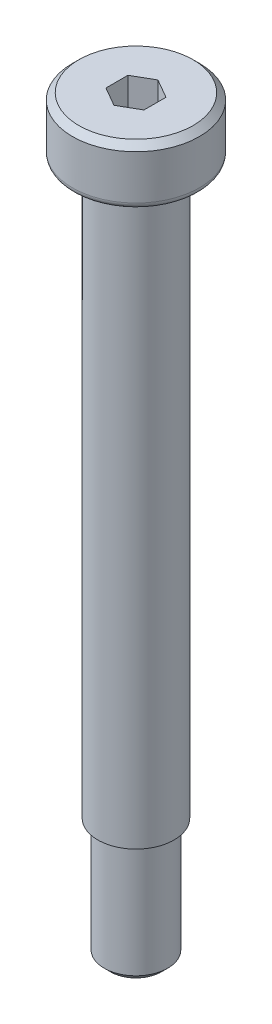
ISO-10303-21;
HEADER;
FILE_DESCRIPTION(('STEP AP214'),'2;1');
FILE_NAME('part.step','',(''),(''),'','','');
FILE_SCHEMA(('AUTOMOTIVE_DESIGN { 1 0 10303 214 1 1 1 1 }'));
ENDSEC;
DATA;
#1=APPLICATION_CONTEXT('core data for automotive mechanical design processes');
#2=APPLICATION_PROTOCOL_DEFINITION('international standard','automotive_design',2000,#1);
#3=PRODUCT_CONTEXT('',#1,'mechanical');
#4=PRODUCT('Part','Part','',(#3));
#5=PRODUCT_RELATED_PRODUCT_CATEGORY('part','',(#4));
#6=PRODUCT_DEFINITION_FORMATION('','',#4);
#7=PRODUCT_DEFINITION_CONTEXT('part definition',#1,'design');
#8=PRODUCT_DEFINITION('design','',#6,#7);
#9=PRODUCT_DEFINITION_SHAPE('','',#8);
#10=(LENGTH_UNIT() NAMED_UNIT(*) SI_UNIT(.MILLI.,.METRE.));
#11=(NAMED_UNIT(*) PLANE_ANGLE_UNIT() SI_UNIT($,.RADIAN.));
#12=(NAMED_UNIT(*) SI_UNIT($,.STERADIAN.) SOLID_ANGLE_UNIT());
#13=UNCERTAINTY_MEASURE_WITH_UNIT(LENGTH_MEASURE(1.E-05),#10,'distance_accuracy_value','');
#14=(GEOMETRIC_REPRESENTATION_CONTEXT(3) GLOBAL_UNCERTAINTY_ASSIGNED_CONTEXT((#13)) GLOBAL_UNIT_ASSIGNED_CONTEXT((#10,
#11,#12)) REPRESENTATION_CONTEXT('',''));
#15=CARTESIAN_POINT('',(0.,0.,0.));
#16=DIRECTION('',(0.,0.,1.));
#17=DIRECTION('',(1.,0.,0.));
#18=AXIS2_PLACEMENT_3D('',#15,#16,#17);
#19=CARTESIAN_POINT('',(0.,0.,0.));
#20=DIRECTION('',(0.,-1.,0.));
#21=DIRECTION('',(0.999999999999999,0.,0.));
#22=AXIS2_PLACEMENT_3D('',#19,#20,#21);
#23=PLANE('',#22);
#24=CARTESIAN_POINT('',(0.,0.,0.));
#25=DIRECTION('',(0.,-1.,0.));
#26=DIRECTION('',(0.999999999999999,0.,0.));
#27=AXIS2_PLACEMENT_3D('',#24,#25,#26);
#28=CIRCLE('',#27,4.5);
#29=CARTESIAN_POINT('',(4.5,0.,0.));
#30=VERTEX_POINT('',#29);
#31=EDGE_CURVE('E205',#30,#30,#28,.F.);
#32=ORIENTED_EDGE('',*,*,#31,.T.);
#33=EDGE_LOOP('',(#32));
#34=FACE_BOUND('',#33,.T.);
#35=DIRECTION('',(0.866025403784438,0.,-0.499999999999999));
#36=VECTOR('',#35,1.);
#37=CARTESIAN_POINT('',(0.,0.,1.73205080756888));
#38=LINE('',#37,#36);
#39=CARTESIAN_POINT('',(0.,0.,1.73205080756888));
#40=VERTEX_POINT('',#39);
#41=CARTESIAN_POINT('',(1.5,0.,0.86602540378445));
#42=VERTEX_POINT('',#41);
#43=EDGE_CURVE('E157',#40,#42,#38,.T.);
#44=ORIENTED_EDGE('',*,*,#43,.F.);
#45=DIRECTION('',(0.866025403784438,0.,0.5));
#46=VECTOR('',#45,1.);
#47=CARTESIAN_POINT('',(-1.5,0.,0.866025403784436));
#48=LINE('',#47,#46);
#49=CARTESIAN_POINT('',(-1.5,0.,0.866025403784436));
#50=VERTEX_POINT('',#49);
#51=EDGE_CURVE('E76',#50,#40,#48,.T.);
#52=ORIENTED_EDGE('',*,*,#51,.F.);
#53=DIRECTION('',(0.,0.,0.999999999999999));
#54=VECTOR('',#53,1.);
#55=CARTESIAN_POINT('',(-1.5,0.,-0.866025403784429));
#56=LINE('',#55,#54);
#57=CARTESIAN_POINT('',(-1.5,0.,-0.866025403784429));
#58=VERTEX_POINT('',#57);
#59=EDGE_CURVE('E170',#58,#50,#56,.T.);
#60=ORIENTED_EDGE('',*,*,#59,.F.);
#61=DIRECTION('',(-0.866025403784438,0.,0.5));
#62=VECTOR('',#61,1.);
#63=CARTESIAN_POINT('',(0.,0.,-1.73205080756887));
#64=LINE('',#63,#62);
#65=CARTESIAN_POINT('',(0.,0.,-1.73205080756887));
#66=VERTEX_POINT('',#65);
#67=EDGE_CURVE('E167',#66,#58,#64,.T.);
#68=ORIENTED_EDGE('',*,*,#67,.F.);
#69=DIRECTION('',(-0.866025403784438,0.,-0.5));
#70=VECTOR('',#69,1.);
#71=CARTESIAN_POINT('',(1.5,0.,-0.866025403784436));
#72=LINE('',#71,#70);
#73=CARTESIAN_POINT('',(1.5,0.,-0.866025403784436));
#74=VERTEX_POINT('',#73);
#75=EDGE_CURVE('E124',#74,#66,#72,.T.);
#76=ORIENTED_EDGE('',*,*,#75,.F.);
#77=DIRECTION('',(0.,0.,-0.999999999999999));
#78=VECTOR('',#77,1.);
#79=CARTESIAN_POINT('',(1.5,0.,0.86602540378445));
#80=LINE('',#79,#78);
#81=EDGE_CURVE('E161',#42,#74,#80,.T.);
#82=ORIENTED_EDGE('',*,*,#81,.F.);
#83=EDGE_LOOP('',(#44,#52,#60,#68,#76,#82));
#84=FACE_BOUND('',#83,.T.);
#85=ADVANCED_FACE('F59',(#34,#84),#23,.F.);
#86=CARTESIAN_POINT('',(0.,5.,0.));
#87=DIRECTION('',(0.,1.,0.));
#88=DIRECTION('',(-0.999999999999999,0.,0.));
#89=AXIS2_PLACEMENT_3D('',#86,#87,#88);
#90=CYLINDRICAL_SURFACE('',#89,5.);
#91=CARTESIAN_POINT('',(0.,-4.,0.));
#92=DIRECTION('',(0.,1.,0.));
#93=DIRECTION('',(-0.999999999999999,0.,0.));
#94=AXIS2_PLACEMENT_3D('',#91,#92,#93);
#95=CIRCLE('',#94,5.);
#96=CARTESIAN_POINT('',(-4.99999999999999,-4.,0.));
#97=VERTEX_POINT('',#96);
#98=EDGE_CURVE('E213',#97,#97,#95,.T.);
#99=ORIENTED_EDGE('',*,*,#98,.T.);
#100=EDGE_LOOP('',(#99));
#101=FACE_BOUND('',#100,.T.);
#102=CARTESIAN_POINT('',(0.,-0.5,0.));
#103=DIRECTION('',(0.,-1.,0.));
#104=DIRECTION('',(0.999999999999999,0.,0.));
#105=AXIS2_PLACEMENT_3D('',#102,#103,#104);
#106=CIRCLE('',#105,5.);
#107=CARTESIAN_POINT('',(5.,-0.5,0.));
#108=VERTEX_POINT('',#107);
#109=EDGE_CURVE('E209',#108,#108,#106,.T.);
#110=ORIENTED_EDGE('',*,*,#109,.T.);
#111=EDGE_LOOP('',(#110));
#112=FACE_BOUND('',#111,.T.);
#113=ADVANCED_FACE('F239',(#101,#112),#90,.T.);
#114=CARTESIAN_POINT('',(5.,-4.5,0.));
#115=DIRECTION('',(0.,1.,0.));
#116=DIRECTION('',(-0.999999999999999,0.,0.));
#117=AXIS2_PLACEMENT_3D('',#114,#115,#116);
#118=PLANE('',#117);
#119=CARTESIAN_POINT('',(0.,-4.5,0.));
#120=DIRECTION('',(0.,1.,0.));
#121=DIRECTION('',(-0.999999999999999,0.,0.));
#122=AXIS2_PLACEMENT_3D('',#119,#120,#121);
#123=CIRCLE('',#122,4.5);
#124=CARTESIAN_POINT('',(-4.49999999999999,-4.5,0.));
#125=VERTEX_POINT('',#124);
#126=EDGE_CURVE('E217',#125,#125,#123,.F.);
#127=ORIENTED_EDGE('',*,*,#126,.T.);
#128=EDGE_LOOP('',(#127));
#129=FACE_BOUND('',#128,.T.);
#130=CARTESIAN_POINT('',(0.,-4.5,0.));
#131=DIRECTION('',(0.,1.,0.));
#132=DIRECTION('',(-0.999999999999999,0.,0.));
#133=AXIS2_PLACEMENT_3D('',#130,#131,#132);
#134=CIRCLE('',#133,2.75);
#135=CARTESIAN_POINT('',(-2.75,-4.5,0.));
#136=VERTEX_POINT('',#135);
#137=EDGE_CURVE('E201',#136,#136,#134,.T.);
#138=ORIENTED_EDGE('',*,*,#137,.T.);
#139=EDGE_LOOP('',(#138));
#140=FACE_BOUND('',#139,.T.);
#141=ADVANCED_FACE('F246',(#129,#140),#118,.F.);
#142=CARTESIAN_POINT('',(0.,5.,0.));
#143=DIRECTION('',(0.,1.,0.));
#144=DIRECTION('',(-0.999999999999999,0.,0.));
#145=AXIS2_PLACEMENT_3D('',#142,#143,#144);
#146=CYLINDRICAL_SURFACE('',#145,2.75);
#147=ORIENTED_EDGE('',*,*,#137,.F.);
#148=EDGE_LOOP('',(#147));
#149=FACE_BOUND('',#148,.T.);
#150=CARTESIAN_POINT('',(0.,-5.,0.));
#151=DIRECTION('',(0.,1.,0.));
#152=DIRECTION('',(-0.999999999999999,0.,0.));
#153=AXIS2_PLACEMENT_3D('',#150,#151,#152);
#154=CIRCLE('',#153,2.75);
#155=CARTESIAN_POINT('',(-2.75,-5.,0.));
#156=VERTEX_POINT('',#155);
#157=EDGE_CURVE('E197',#156,#156,#154,.T.);
#158=ORIENTED_EDGE('',*,*,#157,.T.);
#159=EDGE_LOOP('',(#158));
#160=FACE_BOUND('',#159,.T.);
#161=ADVANCED_FACE('F305',(#149,#160),#146,.T.);
#162=CARTESIAN_POINT('',(2.75,-5.,0.));
#163=DIRECTION('',(0.,-1.,0.));
#164=DIRECTION('',(0.999999999999999,0.,0.));
#165=AXIS2_PLACEMENT_3D('',#162,#163,#164);
#166=PLANE('',#165);
#167=ORIENTED_EDGE('',*,*,#157,.F.);
#168=EDGE_LOOP('',(#167));
#169=FACE_BOUND('',#168,.T.);
#170=CARTESIAN_POINT('',(0.,-5.,0.));
#171=DIRECTION('',(0.,1.,0.));
#172=DIRECTION('',(-0.999999999999999,0.,0.));
#173=AXIS2_PLACEMENT_3D('',#170,#171,#172);
#174=CIRCLE('',#173,3.);
#175=CARTESIAN_POINT('',(-3.,-5.,0.));
#176=VERTEX_POINT('',#175);
#177=EDGE_CURVE('E193',#176,#176,#174,.T.);
#178=ORIENTED_EDGE('',*,*,#177,.T.);
#179=EDGE_LOOP('',(#178));
#180=FACE_BOUND('',#179,.T.);
#181=ADVANCED_FACE('F301',(#169,#180),#166,.F.);
#182=CARTESIAN_POINT('',(0.,5.,0.));
#183=DIRECTION('',(0.,1.,0.));
#184=DIRECTION('',(-0.999999999999999,0.,0.));
#185=AXIS2_PLACEMENT_3D('',#182,#183,#184);
#186=CYLINDRICAL_SURFACE('',#185,3.00000000000001);
#187=ORIENTED_EDGE('',*,*,#177,.F.);
#188=EDGE_LOOP('',(#187));
#189=FACE_BOUND('',#188,.T.);
#190=CARTESIAN_POINT('',(0.,-49.5,0.));
#191=DIRECTION('',(0.,1.,0.));
#192=DIRECTION('',(-0.999999999999999,0.,0.));
#193=AXIS2_PLACEMENT_3D('',#190,#191,#192);
#194=CIRCLE('',#193,3.00000000000001);
#195=CARTESIAN_POINT('',(-3.,-49.5,0.));
#196=VERTEX_POINT('',#195);
#197=EDGE_CURVE('E189',#196,#196,#194,.T.);
#198=ORIENTED_EDGE('',*,*,#197,.T.);
#199=EDGE_LOOP('',(#198));
#200=FACE_BOUND('',#199,.T.);
#201=ADVANCED_FACE('F297',(#189,#200),#186,.T.);
#202=CARTESIAN_POINT('',(3.00000000000001,-49.5,0.));
#203=DIRECTION('',(0.,1.,0.));
#204=DIRECTION('',(-0.999999999999999,0.,0.));
#205=AXIS2_PLACEMENT_3D('',#202,#203,#204);
#206=PLANE('',#205);
#207=ORIENTED_EDGE('',*,*,#197,.F.);
#208=EDGE_LOOP('',(#207));
#209=FACE_BOUND('',#208,.T.);
#210=CARTESIAN_POINT('',(0.,-49.5,0.));
#211=DIRECTION('',(0.,1.,0.));
#212=DIRECTION('',(-0.999999999999999,0.,0.));
#213=AXIS2_PLACEMENT_3D('',#210,#211,#212);
#214=CIRCLE('',#213,2.5);
#215=CARTESIAN_POINT('',(-2.49999999999999,-49.5,0.));
#216=VERTEX_POINT('',#215);
#217=EDGE_CURVE('E176',#216,#216,#214,.T.);
#218=ORIENTED_EDGE('',*,*,#217,.T.);
#219=EDGE_LOOP('',(#218));
#220=FACE_BOUND('',#219,.T.);
#221=ADVANCED_FACE('F294',(#209,#220),#206,.F.);
#222=CARTESIAN_POINT('',(0.,5.,0.));
#223=DIRECTION('',(0.,1.,0.));
#224=DIRECTION('',(-0.999999999999999,0.,0.));
#225=AXIS2_PLACEMENT_3D('',#222,#223,#224);
#226=CYLINDRICAL_SURFACE('',#225,2.5);
#227=CARTESIAN_POINT('',(0.,-58.5,0.));
#228=DIRECTION('',(0.,1.,0.));
#229=DIRECTION('',(-0.999999999999999,0.,0.));
#230=AXIS2_PLACEMENT_3D('',#227,#228,#229);
#231=CIRCLE('',#230,2.5);
#232=CARTESIAN_POINT('',(-2.5,-58.5,0.));
#233=VERTEX_POINT('',#232);
#234=EDGE_CURVE('E69',#233,#233,#231,.T.);
#235=ORIENTED_EDGE('',*,*,#234,.T.);
#236=EDGE_LOOP('',(#235));
#237=FACE_BOUND('',#236,.T.);
#238=ORIENTED_EDGE('',*,*,#217,.F.);
#239=EDGE_LOOP('',(#238));
#240=FACE_BOUND('',#239,.T.);
#241=ADVANCED_FACE('F225',(#237,#240),#226,.T.);
#242=CARTESIAN_POINT('',(2.5,-59.,0.));
#243=DIRECTION('',(0.,1.,0.));
#244=DIRECTION('',(-0.999999999999999,0.,0.));
#245=AXIS2_PLACEMENT_3D('',#242,#243,#244);
#246=PLANE('',#245);
#247=CARTESIAN_POINT('',(0.,-59.,0.));
#248=DIRECTION('',(0.,1.,0.));
#249=DIRECTION('',(-0.999999999999999,0.,0.));
#250=AXIS2_PLACEMENT_3D('',#247,#248,#249);
#251=CIRCLE('',#250,1.99999999999999);
#252=CARTESIAN_POINT('',(-1.99999999999999,-59.,0.));
#253=VERTEX_POINT('',#252);
#254=EDGE_CURVE('E13',#253,#253,#251,.F.);
#255=ORIENTED_EDGE('',*,*,#254,.T.);
#256=EDGE_LOOP('',(#255));
#257=FACE_BOUND('',#256,.T.);
#258=ADVANCED_FACE('F288',(#257),#246,.F.);
#259=CARTESIAN_POINT('',(-1.5,-2.4,0.866025403784443));
#260=DIRECTION('',(-0.5,0.,0.866025403784438));
#261=DIRECTION('',(0.866025403784438,0.,0.5));
#262=AXIS2_PLACEMENT_3D('',#259,#260,#261);
#263=PLANE('',#262);
#264=ORIENTED_EDGE('',*,*,#51,.T.);
#265=DIRECTION('',(0.,1.,0.));
#266=VECTOR('',#265,1.);
#267=CARTESIAN_POINT('',(0.,-2.4,1.73205080756889));
#268=LINE('',#267,#266);
#269=CARTESIAN_POINT('',(0.,-2.4,1.73205080756889));
#270=VERTEX_POINT('',#269);
#271=EDGE_CURVE('E106',#270,#40,#268,.T.);
#272=ORIENTED_EDGE('',*,*,#271,.F.);
#273=DIRECTION('',(0.866025403784438,0.,0.5));
#274=VECTOR('',#273,1.);
#275=CARTESIAN_POINT('',(-1.5,-2.4,0.866025403784443));
#276=LINE('',#275,#274);
#277=CARTESIAN_POINT('',(-1.5,-2.4,0.866025403784443));
#278=VERTEX_POINT('',#277);
#279=EDGE_CURVE('E173',#278,#270,#276,.T.);
#280=ORIENTED_EDGE('',*,*,#279,.F.);
#281=DIRECTION('',(0.,1.,0.));
#282=VECTOR('',#281,1.);
#283=CARTESIAN_POINT('',(-1.5,-2.4,0.866025403784443));
#284=LINE('',#283,#282);
#285=EDGE_CURVE('E84',#278,#50,#284,.T.);
#286=ORIENTED_EDGE('',*,*,#285,.T.);
#287=EDGE_LOOP('',(#264,#272,#280,#286));
#288=FACE_BOUND('',#287,.T.);
#289=ADVANCED_FACE('F278',(#288),#263,.F.);
#290=CARTESIAN_POINT('',(-1.49999999999999,-2.4,-0.866025403784422));
#291=DIRECTION('',(-0.999999999999999,0.,0.));
#292=DIRECTION('',(0.,-1.,0.));
#293=AXIS2_PLACEMENT_3D('',#290,#291,#292);
#294=PLANE('',#293);
#295=ORIENTED_EDGE('',*,*,#59,.T.);
#296=ORIENTED_EDGE('',*,*,#285,.F.);
#297=DIRECTION('',(0.,0.,0.999999999999999));
#298=VECTOR('',#297,1.);
#299=CARTESIAN_POINT('',(-1.49999999999999,-2.4,-0.866025403784422));
#300=LINE('',#299,#298);
#301=CARTESIAN_POINT('',(-1.49999999999999,-2.4,-0.866025403784422));
#302=VERTEX_POINT('',#301);
#303=EDGE_CURVE('E138',#302,#278,#300,.T.);
#304=ORIENTED_EDGE('',*,*,#303,.F.);
#305=DIRECTION('',(0.,1.,0.));
#306=VECTOR('',#305,1.);
#307=CARTESIAN_POINT('',(-1.49999999999999,-2.4,-0.866025403784422));
#308=LINE('',#307,#306);
#309=EDGE_CURVE('E129',#302,#58,#308,.T.);
#310=ORIENTED_EDGE('',*,*,#309,.T.);
#311=EDGE_LOOP('',(#295,#296,#304,#310));
#312=FACE_BOUND('',#311,.T.);
#313=ADVANCED_FACE('F275',(#312),#294,.F.);
#314=CARTESIAN_POINT('',(0.,-2.4,-1.73205080756887));
#315=DIRECTION('',(-0.5,0.,-0.866025403784438));
#316=DIRECTION('',(-0.866025403784438,0.,0.5));
#317=AXIS2_PLACEMENT_3D('',#314,#315,#316);
#318=PLANE('',#317);
#319=ORIENTED_EDGE('',*,*,#67,.T.);
#320=ORIENTED_EDGE('',*,*,#309,.F.);
#321=DIRECTION('',(-0.866025403784438,0.,0.5));
#322=VECTOR('',#321,1.);
#323=CARTESIAN_POINT('',(0.,-2.4,-1.73205080756887));
#324=LINE('',#323,#322);
#325=CARTESIAN_POINT('',(0.,-2.4,-1.73205080756887));
#326=VERTEX_POINT('',#325);
#327=EDGE_CURVE('E133',#326,#302,#324,.T.);
#328=ORIENTED_EDGE('',*,*,#327,.F.);
#329=DIRECTION('',(0.,1.,0.));
#330=VECTOR('',#329,1.);
#331=CARTESIAN_POINT('',(0.,-2.4,-1.73205080756887));
#332=LINE('',#331,#330);
#333=EDGE_CURVE('E117',#326,#66,#332,.T.);
#334=ORIENTED_EDGE('',*,*,#333,.T.);
#335=EDGE_LOOP('',(#319,#320,#328,#334));
#336=FACE_BOUND('',#335,.T.);
#337=ADVANCED_FACE('F134',(#336),#318,.F.);
#338=CARTESIAN_POINT('',(1.5,-2.4,-0.866025403784436));
#339=DIRECTION('',(0.5,0.,-0.866025403784438));
#340=DIRECTION('',(-0.866025403784438,0.,-0.5));
#341=AXIS2_PLACEMENT_3D('',#338,#339,#340);
#342=PLANE('',#341);
#343=ORIENTED_EDGE('',*,*,#75,.T.);
#344=ORIENTED_EDGE('',*,*,#333,.F.);
#345=DIRECTION('',(-0.866025403784438,0.,-0.5));
#346=VECTOR('',#345,1.);
#347=CARTESIAN_POINT('',(1.5,-2.4,-0.866025403784436));
#348=LINE('',#347,#346);
#349=CARTESIAN_POINT('',(1.5,-2.4,-0.866025403784436));
#350=VERTEX_POINT('',#349);
#351=EDGE_CURVE('E121',#350,#326,#348,.T.);
#352=ORIENTED_EDGE('',*,*,#351,.F.);
#353=DIRECTION('',(0.,1.,0.));
#354=VECTOR('',#353,1.);
#355=CARTESIAN_POINT('',(1.5,-2.4,-0.866025403784436));
#356=LINE('',#355,#354);
#357=EDGE_CURVE('E130',#350,#74,#356,.T.);
#358=ORIENTED_EDGE('',*,*,#357,.T.);
#359=EDGE_LOOP('',(#343,#344,#352,#358));
#360=FACE_BOUND('',#359,.T.);
#361=ADVANCED_FACE('F119',(#360),#342,.F.);
#362=CARTESIAN_POINT('',(1.5,-2.4,0.86602540378445));
#363=DIRECTION('',(0.999999999999999,0.,0.));
#364=DIRECTION('',(0.,1.,0.));
#365=AXIS2_PLACEMENT_3D('',#362,#363,#364);
#366=PLANE('',#365);
#367=ORIENTED_EDGE('',*,*,#81,.T.);
#368=ORIENTED_EDGE('',*,*,#357,.F.);
#369=DIRECTION('',(0.,0.,-0.999999999999999));
#370=VECTOR('',#369,1.);
#371=CARTESIAN_POINT('',(1.5,-2.4,0.86602540378445));
#372=LINE('',#371,#370);
#373=CARTESIAN_POINT('',(1.5,-2.4,0.86602540378445));
#374=VERTEX_POINT('',#373);
#375=EDGE_CURVE('E144',#374,#350,#372,.T.);
#376=ORIENTED_EDGE('',*,*,#375,.F.);
#377=DIRECTION('',(0.,1.,0.));
#378=VECTOR('',#377,1.);
#379=CARTESIAN_POINT('',(1.5,-2.4,0.86602540378445));
#380=LINE('',#379,#378);
#381=EDGE_CURVE('E181',#374,#42,#380,.T.);
#382=ORIENTED_EDGE('',*,*,#381,.T.);
#383=EDGE_LOOP('',(#367,#368,#376,#382));
#384=FACE_BOUND('',#383,.T.);
#385=ADVANCED_FACE('F271',(#384),#366,.F.);
#386=CARTESIAN_POINT('',(0.,-2.4,1.73205080756889));
#387=DIRECTION('',(0.499999999999999,0.,0.866025403784438));
#388=DIRECTION('',(0.866025403784438,0.,-0.499999999999999));
#389=AXIS2_PLACEMENT_3D('',#386,#387,#388);
#390=PLANE('',#389);
#391=ORIENTED_EDGE('',*,*,#43,.T.);
#392=ORIENTED_EDGE('',*,*,#381,.F.);
#393=DIRECTION('',(0.866025403784438,0.,-0.499999999999999));
#394=VECTOR('',#393,1.);
#395=CARTESIAN_POINT('',(0.,-2.4,1.73205080756889));
#396=LINE('',#395,#394);
#397=EDGE_CURVE('E149',#270,#374,#396,.T.);
#398=ORIENTED_EDGE('',*,*,#397,.F.);
#399=ORIENTED_EDGE('',*,*,#271,.T.);
#400=EDGE_LOOP('',(#391,#392,#398,#399));
#401=FACE_BOUND('',#400,.T.);
#402=ADVANCED_FACE('F261',(#401),#390,.F.);
#403=CARTESIAN_POINT('',(0.,-2.4,0.));
#404=DIRECTION('',(0.,1.,0.));
#405=DIRECTION('',(-0.999999999999999,0.,0.));
#406=AXIS2_PLACEMENT_3D('',#403,#404,#405);
#407=PLANE('',#406);
#408=ORIENTED_EDGE('',*,*,#279,.T.);
#409=ORIENTED_EDGE('',*,*,#397,.T.);
#410=ORIENTED_EDGE('',*,*,#375,.T.);
#411=ORIENTED_EDGE('',*,*,#351,.T.);
#412=ORIENTED_EDGE('',*,*,#327,.T.);
#413=ORIENTED_EDGE('',*,*,#303,.T.);
#414=EDGE_LOOP('',(#408,#409,#410,#411,#412,#413));
#415=FACE_BOUND('',#414,.T.);
#416=ADVANCED_FACE('F141',(#415),#407,.T.);
#417=CARTESIAN_POINT('',(0.,0.,0.));
#418=DIRECTION('',(0.,-1.,0.));
#419=DIRECTION('',(0.999999999999999,0.,0.));
#420=AXIS2_PLACEMENT_3D('',#417,#418,#419);
#421=CONICAL_SURFACE('',#420,4.5,0.785398163397445);
#422=ORIENTED_EDGE('',*,*,#109,.F.);
#423=EDGE_LOOP('',(#422));
#424=FACE_BOUND('',#423,.T.);
#425=ORIENTED_EDGE('',*,*,#31,.F.);
#426=EDGE_LOOP('',(#425));
#427=FACE_BOUND('',#426,.T.);
#428=ADVANCED_FACE('F235',(#424,#427),#421,.T.);
#429=CARTESIAN_POINT('',(0.,-4.,0.));
#430=DIRECTION('',(0.,1.,0.));
#431=DIRECTION('',(-0.999999999999999,0.,0.));
#432=AXIS2_PLACEMENT_3D('',#429,#430,#431);
#433=TOROIDAL_SURFACE('',#432,4.5,0.5);
#434=ORIENTED_EDGE('',*,*,#126,.F.);
#435=EDGE_LOOP('',(#434));
#436=FACE_BOUND('',#435,.T.);
#437=ORIENTED_EDGE('',*,*,#98,.F.);
#438=EDGE_LOOP('',(#437));
#439=FACE_BOUND('',#438,.T.);
#440=ADVANCED_FACE('F229',(#436,#439),#433,.T.);
#441=CARTESIAN_POINT('',(0.,-58.5,0.));
#442=DIRECTION('',(0.,1.,0.));
#443=DIRECTION('',(-0.999999999999999,0.,0.));
#444=AXIS2_PLACEMENT_3D('',#441,#442,#443);
#445=CONICAL_SURFACE('',#444,2.5,0.785398163397446);
#446=ORIENTED_EDGE('',*,*,#254,.F.);
#447=EDGE_LOOP('',(#446));
#448=FACE_BOUND('',#447,.T.);
#449=ORIENTED_EDGE('',*,*,#234,.F.);
#450=EDGE_LOOP('',(#449));
#451=FACE_BOUND('',#450,.T.);
#452=ADVANCED_FACE('F62',(#448,#451),#445,.T.);
#453=CLOSED_SHELL('',(#85,#113,#141,#161,#181,#201,#221,#241,#258,#289,#313,#337,#361,#385,#402,
#416,#428,#440,#452));
#454=MANIFOLD_SOLID_BREP('B2',#453);
#455=ADVANCED_BREP_SHAPE_REPRESENTATION('',(#18,#454),#14);
#456=SHAPE_DEFINITION_REPRESENTATION(#9,#455);
ENDSEC;
END-ISO-10303-21;
